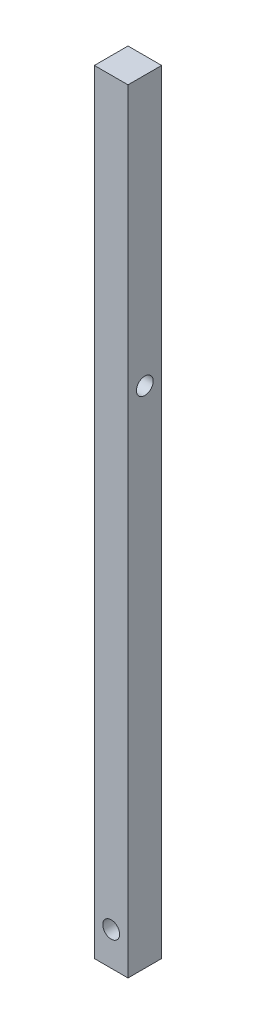
ISO-10303-21;
HEADER;
FILE_DESCRIPTION(('STEP AP214'),'2;1');
FILE_NAME('part.step','',(''),(''),'','','');
FILE_SCHEMA(('AUTOMOTIVE_DESIGN { 1 0 10303 214 1 1 1 1 }'));
ENDSEC;
DATA;
#1=APPLICATION_CONTEXT('core data for automotive mechanical design processes');
#2=APPLICATION_PROTOCOL_DEFINITION('international standard','automotive_design',2000,#1);
#3=PRODUCT_CONTEXT('',#1,'mechanical');
#4=PRODUCT('Part','Part','',(#3));
#5=PRODUCT_RELATED_PRODUCT_CATEGORY('part','',(#4));
#6=PRODUCT_DEFINITION_FORMATION('','',#4);
#7=PRODUCT_DEFINITION_CONTEXT('part definition',#1,'design');
#8=PRODUCT_DEFINITION('design','',#6,#7);
#9=PRODUCT_DEFINITION_SHAPE('','',#8);
#10=(LENGTH_UNIT() NAMED_UNIT(*) SI_UNIT(.MILLI.,.METRE.));
#11=(NAMED_UNIT(*) PLANE_ANGLE_UNIT() SI_UNIT($,.RADIAN.));
#12=(NAMED_UNIT(*) SI_UNIT($,.STERADIAN.) SOLID_ANGLE_UNIT());
#13=UNCERTAINTY_MEASURE_WITH_UNIT(LENGTH_MEASURE(1.E-05),#10,'distance_accuracy_value','');
#14=(GEOMETRIC_REPRESENTATION_CONTEXT(3) GLOBAL_UNCERTAINTY_ASSIGNED_CONTEXT((#13)) GLOBAL_UNIT_ASSIGNED_CONTEXT((#10,
#11,#12)) REPRESENTATION_CONTEXT('',''));
#15=CARTESIAN_POINT('',(0.,0.,0.));
#16=DIRECTION('',(0.,0.,1.));
#17=DIRECTION('',(1.,0.,0.));
#18=AXIS2_PLACEMENT_3D('',#15,#16,#17);
#19=CARTESIAN_POINT('',(5.,300.,-5.));
#20=DIRECTION('',(-1.,0.,0.));
#21=DIRECTION('',(0.,0.,1.));
#22=AXIS2_PLACEMENT_3D('',#19,#20,#21);
#23=PLANE('',#22);
#24=CARTESIAN_POINT('',(5.,150.,0.));
#25=DIRECTION('',(-1.,0.,0.));
#26=DIRECTION('',(0.,0.,1.));
#27=AXIS2_PLACEMENT_3D('',#24,#25,#26);
#28=CIRCLE('',#27,2.5);
#29=CARTESIAN_POINT('',(5.,150.,2.5));
#30=VERTEX_POINT('',#29);
#31=EDGE_CURVE('E100',#30,#30,#28,.T.);
#32=ORIENTED_EDGE('',*,*,#31,.T.);
#33=EDGE_LOOP('',(#32));
#34=FACE_BOUND('',#33,.T.);
#35=DIRECTION('',(0.,0.,-1.));
#36=VECTOR('',#35,1.);
#37=CARTESIAN_POINT('',(5.,230.,-5.));
#38=LINE('',#37,#36);
#39=CARTESIAN_POINT('',(5.,230.,5.));
#40=VERTEX_POINT('',#39);
#41=CARTESIAN_POINT('',(5.,230.,-5.));
#42=VERTEX_POINT('',#41);
#43=EDGE_CURVE('E81',#40,#42,#38,.T.);
#44=ORIENTED_EDGE('',*,*,#43,.F.);
#45=DIRECTION('',(0.,-1.,0.));
#46=VECTOR('',#45,1.);
#47=CARTESIAN_POINT('',(5.,300.,5.));
#48=LINE('',#47,#46);
#49=CARTESIAN_POINT('',(5.,0.,5.));
#50=VERTEX_POINT('',#49);
#51=EDGE_CURVE('E65',#40,#50,#48,.T.);
#52=ORIENTED_EDGE('',*,*,#51,.T.);
#53=DIRECTION('',(0.,0.,-1.));
#54=VECTOR('',#53,1.);
#55=CARTESIAN_POINT('',(5.,0.,-5.));
#56=LINE('',#55,#54);
#57=CARTESIAN_POINT('',(5.,0.,-5.));
#58=VERTEX_POINT('',#57);
#59=EDGE_CURVE('E96',#50,#58,#56,.T.);
#60=ORIENTED_EDGE('',*,*,#59,.T.);
#61=DIRECTION('',(0.,-1.,0.));
#62=VECTOR('',#61,1.);
#63=CARTESIAN_POINT('',(5.,300.,-5.));
#64=LINE('',#63,#62);
#65=EDGE_CURVE('E12',#42,#58,#64,.T.);
#66=ORIENTED_EDGE('',*,*,#65,.F.);
#67=EDGE_LOOP('',(#44,#52,#60,#66));
#68=FACE_BOUND('',#67,.T.);
#69=ADVANCED_FACE('F43',(#34,#68),#23,.F.);
#70=CARTESIAN_POINT('',(-5.,300.,-5.));
#71=DIRECTION('',(0.,0.,1.));
#72=DIRECTION('',(1.,0.,0.));
#73=AXIS2_PLACEMENT_3D('',#70,#71,#72);
#74=PLANE('',#73);
#75=CARTESIAN_POINT('',(0.,10.,-5.));
#76=DIRECTION('',(0.,0.,-1.));
#77=DIRECTION('',(-1.,0.,0.));
#78=AXIS2_PLACEMENT_3D('',#75,#76,#77);
#79=CIRCLE('',#78,2.5);
#80=CARTESIAN_POINT('',(-2.5,10.,-5.));
#81=VERTEX_POINT('',#80);
#82=EDGE_CURVE('E126',#81,#81,#79,.T.);
#83=ORIENTED_EDGE('',*,*,#82,.F.);
#84=EDGE_LOOP('',(#83));
#85=FACE_BOUND('',#84,.T.);
#86=DIRECTION('',(-1.,0.,0.));
#87=VECTOR('',#86,1.);
#88=CARTESIAN_POINT('',(-5.,230.,-5.));
#89=LINE('',#88,#87);
#90=CARTESIAN_POINT('',(-5.,230.,-5.));
#91=VERTEX_POINT('',#90);
#92=EDGE_CURVE('E84',#42,#91,#89,.T.);
#93=ORIENTED_EDGE('',*,*,#92,.F.);
#94=ORIENTED_EDGE('',*,*,#65,.T.);
#95=DIRECTION('',(-1.,0.,0.));
#96=VECTOR('',#95,1.);
#97=CARTESIAN_POINT('',(-5.,0.,-5.));
#98=LINE('',#97,#96);
#99=CARTESIAN_POINT('',(-5.,0.,-5.));
#100=VERTEX_POINT('',#99);
#101=EDGE_CURVE('E99',#58,#100,#98,.T.);
#102=ORIENTED_EDGE('',*,*,#101,.T.);
#103=DIRECTION('',(0.,-1.,0.));
#104=VECTOR('',#103,1.);
#105=CARTESIAN_POINT('',(-5.,300.,-5.));
#106=LINE('',#105,#104);
#107=EDGE_CURVE('E50',#91,#100,#106,.T.);
#108=ORIENTED_EDGE('',*,*,#107,.F.);
#109=EDGE_LOOP('',(#93,#94,#102,#108));
#110=FACE_BOUND('',#109,.T.);
#111=ADVANCED_FACE('F91',(#85,#110),#74,.F.);
#112=CARTESIAN_POINT('',(-5.,300.,-5.));
#113=DIRECTION('',(1.,0.,0.));
#114=DIRECTION('',(0.,0.,-1.));
#115=AXIS2_PLACEMENT_3D('',#112,#113,#114);
#116=PLANE('',#115);
#117=CARTESIAN_POINT('',(-5.,150.,0.));
#118=DIRECTION('',(-1.,0.,0.));
#119=DIRECTION('',(0.,0.,1.));
#120=AXIS2_PLACEMENT_3D('',#117,#118,#119);
#121=CIRCLE('',#120,2.5);
#122=CARTESIAN_POINT('',(-5.,150.,2.5));
#123=VERTEX_POINT('',#122);
#124=EDGE_CURVE('E105',#123,#123,#121,.T.);
#125=ORIENTED_EDGE('',*,*,#124,.F.);
#126=EDGE_LOOP('',(#125));
#127=FACE_BOUND('',#126,.T.);
#128=DIRECTION('',(0.,0.,1.));
#129=VECTOR('',#128,1.);
#130=CARTESIAN_POINT('',(-5.,230.,-5.));
#131=LINE('',#130,#129);
#132=CARTESIAN_POINT('',(-5.,230.,5.));
#133=VERTEX_POINT('',#132);
#134=EDGE_CURVE('E57',#91,#133,#131,.T.);
#135=ORIENTED_EDGE('',*,*,#134,.F.);
#136=ORIENTED_EDGE('',*,*,#107,.T.);
#137=DIRECTION('',(0.,0.,1.));
#138=VECTOR('',#137,1.);
#139=CARTESIAN_POINT('',(-5.,0.,-5.));
#140=LINE('',#139,#138);
#141=CARTESIAN_POINT('',(-5.,0.,5.));
#142=VERTEX_POINT('',#141);
#143=EDGE_CURVE('E102',#100,#142,#140,.T.);
#144=ORIENTED_EDGE('',*,*,#143,.T.);
#145=DIRECTION('',(0.,-1.,0.));
#146=VECTOR('',#145,1.);
#147=CARTESIAN_POINT('',(-5.,300.,5.));
#148=LINE('',#147,#146);
#149=EDGE_CURVE('E114',#133,#142,#148,.T.);
#150=ORIENTED_EDGE('',*,*,#149,.F.);
#151=EDGE_LOOP('',(#135,#136,#144,#150));
#152=FACE_BOUND('',#151,.T.);
#153=ADVANCED_FACE('F116',(#127,#152),#116,.F.);
#154=CARTESIAN_POINT('',(-5.,300.,5.));
#155=DIRECTION('',(0.,0.,-1.));
#156=DIRECTION('',(-1.,0.,0.));
#157=AXIS2_PLACEMENT_3D('',#154,#155,#156);
#158=PLANE('',#157);
#159=CARTESIAN_POINT('',(0.,10.,5.));
#160=DIRECTION('',(0.,0.,-1.));
#161=DIRECTION('',(-1.,0.,0.));
#162=AXIS2_PLACEMENT_3D('',#159,#160,#161);
#163=CIRCLE('',#162,2.5);
#164=CARTESIAN_POINT('',(-2.5,10.,5.));
#165=VERTEX_POINT('',#164);
#166=EDGE_CURVE('E87',#165,#165,#163,.T.);
#167=ORIENTED_EDGE('',*,*,#166,.T.);
#168=EDGE_LOOP('',(#167));
#169=FACE_BOUND('',#168,.T.);
#170=DIRECTION('',(1.,0.,0.));
#171=VECTOR('',#170,1.);
#172=CARTESIAN_POINT('',(-5.,230.,5.));
#173=LINE('',#172,#171);
#174=EDGE_CURVE('E85',#133,#40,#173,.T.);
#175=ORIENTED_EDGE('',*,*,#174,.F.);
#176=ORIENTED_EDGE('',*,*,#149,.T.);
#177=DIRECTION('',(1.,0.,0.));
#178=VECTOR('',#177,1.);
#179=CARTESIAN_POINT('',(-5.,0.,5.));
#180=LINE('',#179,#178);
#181=EDGE_CURVE('E111',#142,#50,#180,.T.);
#182=ORIENTED_EDGE('',*,*,#181,.T.);
#183=ORIENTED_EDGE('',*,*,#51,.F.);
#184=EDGE_LOOP('',(#175,#176,#182,#183));
#185=FACE_BOUND('',#184,.T.);
#186=ADVANCED_FACE('F121',(#169,#185),#158,.F.);
#187=CARTESIAN_POINT('',(0.,0.,0.));
#188=DIRECTION('',(0.,1.,0.));
#189=DIRECTION('',(0.,0.,1.));
#190=AXIS2_PLACEMENT_3D('',#187,#188,#189);
#191=PLANE('',#190);
#192=ORIENTED_EDGE('',*,*,#59,.F.);
#193=ORIENTED_EDGE('',*,*,#181,.F.);
#194=ORIENTED_EDGE('',*,*,#143,.F.);
#195=ORIENTED_EDGE('',*,*,#101,.F.);
#196=EDGE_LOOP('',(#192,#193,#194,#195));
#197=FACE_BOUND('',#196,.T.);
#198=ADVANCED_FACE('F119',(#197),#191,.F.);
#199=CARTESIAN_POINT('',(5.,150.,0.));
#200=DIRECTION('',(-1.,0.,0.));
#201=DIRECTION('',(0.,0.,1.));
#202=AXIS2_PLACEMENT_3D('',#199,#200,#201);
#203=CYLINDRICAL_SURFACE('',#202,2.5);
#204=ORIENTED_EDGE('',*,*,#31,.F.);
#205=EDGE_LOOP('',(#204));
#206=FACE_BOUND('',#205,.T.);
#207=ORIENTED_EDGE('',*,*,#124,.T.);
#208=EDGE_LOOP('',(#207));
#209=FACE_BOUND('',#208,.T.);
#210=ADVANCED_FACE('F153',(#206,#209),#203,.F.);
#211=CARTESIAN_POINT('',(0.,230.,0.));
#212=DIRECTION('',(0.,1.,0.));
#213=DIRECTION('',(0.,0.,1.));
#214=AXIS2_PLACEMENT_3D('',#211,#212,#213);
#215=PLANE('',#214);
#216=ORIENTED_EDGE('',*,*,#43,.T.);
#217=ORIENTED_EDGE('',*,*,#92,.T.);
#218=ORIENTED_EDGE('',*,*,#134,.T.);
#219=ORIENTED_EDGE('',*,*,#174,.T.);
#220=EDGE_LOOP('',(#216,#217,#218,#219));
#221=FACE_BOUND('',#220,.T.);
#222=ADVANCED_FACE('F83',(#221),#215,.T.);
#223=CARTESIAN_POINT('',(0.,10.,5.));
#224=DIRECTION('',(0.,0.,-1.));
#225=DIRECTION('',(-1.,0.,0.));
#226=AXIS2_PLACEMENT_3D('',#223,#224,#225);
#227=CYLINDRICAL_SURFACE('',#226,2.5);
#228=ORIENTED_EDGE('',*,*,#166,.F.);
#229=EDGE_LOOP('',(#228));
#230=FACE_BOUND('',#229,.T.);
#231=ORIENTED_EDGE('',*,*,#82,.T.);
#232=EDGE_LOOP('',(#231));
#233=FACE_BOUND('',#232,.T.);
#234=ADVANCED_FACE('F134',(#230,#233),#227,.F.);
#235=CLOSED_SHELL('',(#69,#111,#153,#186,#198,#210,#222,#234));
#236=MANIFOLD_SOLID_BREP('B2',#235);
#237=ADVANCED_BREP_SHAPE_REPRESENTATION('',(#18,#236),#14);
#238=SHAPE_DEFINITION_REPRESENTATION(#9,#237);
ENDSEC;
END-ISO-10303-21;
